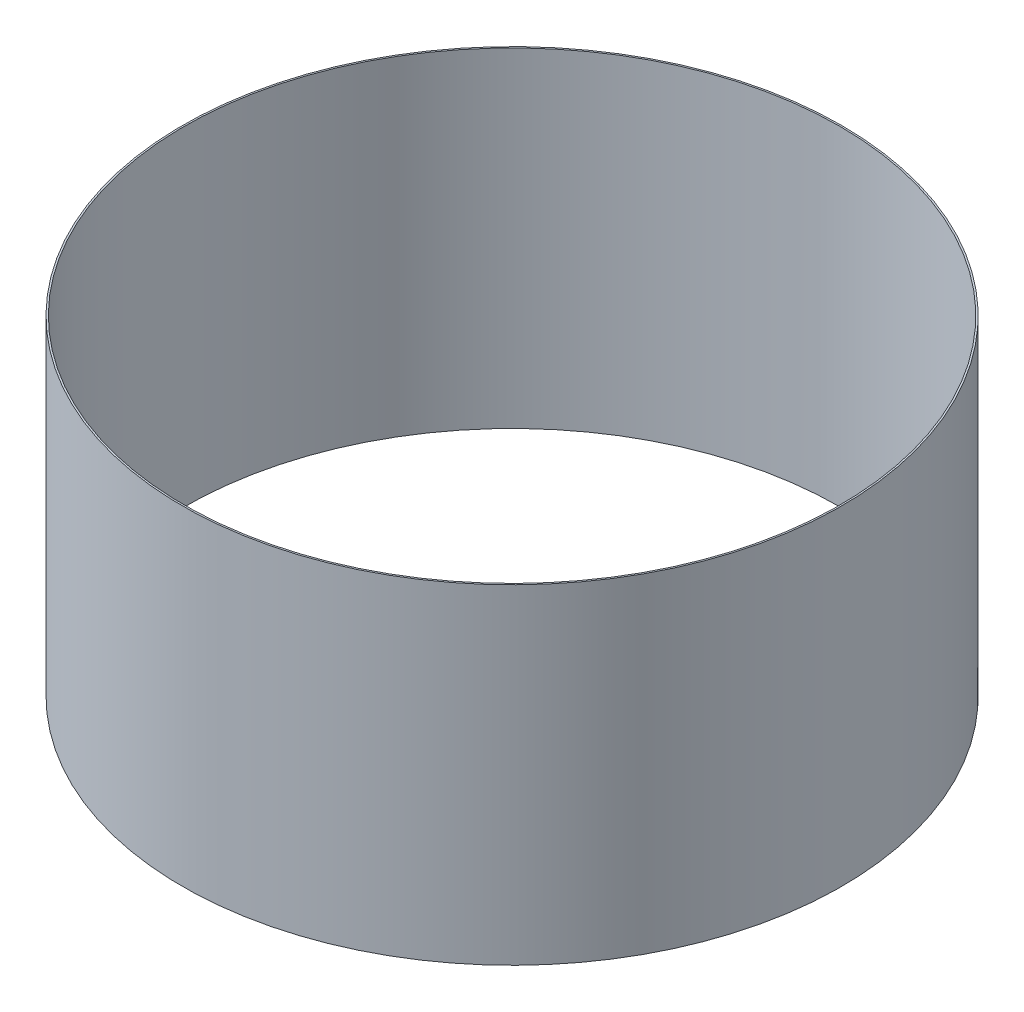
ISO-10303-21;
HEADER;
FILE_DESCRIPTION(('STEP AP214'),'2;1');
FILE_NAME('part.step','',(''),(''),'','','');
FILE_SCHEMA(('AUTOMOTIVE_DESIGN { 1 0 10303 214 1 1 1 1 }'));
ENDSEC;
DATA;
#1=APPLICATION_CONTEXT('core data for automotive mechanical design processes');
#2=APPLICATION_PROTOCOL_DEFINITION('international standard','automotive_design',2000,#1);
#3=PRODUCT_CONTEXT('',#1,'mechanical');
#4=PRODUCT('Part','Part','',(#3));
#5=PRODUCT_RELATED_PRODUCT_CATEGORY('part','',(#4));
#6=PRODUCT_DEFINITION_FORMATION('','',#4);
#7=PRODUCT_DEFINITION_CONTEXT('part definition',#1,'design');
#8=PRODUCT_DEFINITION('design','',#6,#7);
#9=PRODUCT_DEFINITION_SHAPE('','',#8);
#10=(LENGTH_UNIT() NAMED_UNIT(*) SI_UNIT(.MILLI.,.METRE.));
#11=(NAMED_UNIT(*) PLANE_ANGLE_UNIT() SI_UNIT($,.RADIAN.));
#12=(NAMED_UNIT(*) SI_UNIT($,.STERADIAN.) SOLID_ANGLE_UNIT());
#13=UNCERTAINTY_MEASURE_WITH_UNIT(LENGTH_MEASURE(1.E-05),#10,'distance_accuracy_value','');
#14=(GEOMETRIC_REPRESENTATION_CONTEXT(3) GLOBAL_UNCERTAINTY_ASSIGNED_CONTEXT((#13)) GLOBAL_UNIT_ASSIGNED_CONTEXT((#10,
#11,#12)) REPRESENTATION_CONTEXT('',''));
#15=CARTESIAN_POINT('',(0.,0.,0.));
#16=DIRECTION('',(0.,0.,1.));
#17=DIRECTION('',(1.,0.,0.));
#18=AXIS2_PLACEMENT_3D('',#15,#16,#17);
#19=CARTESIAN_POINT('',(0.,200.,0.));
#20=DIRECTION('',(0.,-1.,0.));
#21=DIRECTION('',(0.,0.,-1.));
#22=AXIS2_PLACEMENT_3D('',#19,#20,#21);
#23=CYLINDRICAL_SURFACE('',#22,200.);
#24=CARTESIAN_POINT('',(0.,0.,0.));
#25=DIRECTION('',(0.,1.,0.));
#26=DIRECTION('',(1.,0.,0.));
#27=AXIS2_PLACEMENT_3D('',#24,#25,#26);
#28=CIRCLE('',#27,200.);
#29=CARTESIAN_POINT('',(-0.0050251256281361,0.,-199.99999993687));
#30=VERTEX_POINT('',#29);
#31=CARTESIAN_POINT('',(0.0050251256281606,0.,-199.99999993687));
#32=VERTEX_POINT('',#31);
#33=EDGE_CURVE('E102',#30,#32,#28,.T.);
#34=ORIENTED_EDGE('',*,*,#33,.T.);
#35=DIRECTION('',(0.,-1.,0.));
#36=VECTOR('',#35,1.);
#37=CARTESIAN_POINT('',(0.0050251256281606,200.,-199.99999993687));
#38=LINE('',#37,#36);
#39=CARTESIAN_POINT('',(0.0050251256281606,200.,-199.99999993687));
#40=VERTEX_POINT('',#39);
#41=EDGE_CURVE('E12',#40,#32,#38,.T.);
#42=ORIENTED_EDGE('',*,*,#41,.F.);
#43=CARTESIAN_POINT('',(0.,200.,0.));
#44=DIRECTION('',(0.,1.,0.));
#45=DIRECTION('',(1.,0.,0.));
#46=AXIS2_PLACEMENT_3D('',#43,#44,#45);
#47=CIRCLE('',#46,200.);
#48=CARTESIAN_POINT('',(-0.0050251256281361,200.,-199.99999993687));
#49=VERTEX_POINT('',#48);
#50=EDGE_CURVE('E79',#49,#40,#47,.T.);
#51=ORIENTED_EDGE('',*,*,#50,.F.);
#52=DIRECTION('',(0.,-1.,0.));
#53=VECTOR('',#52,1.);
#54=CARTESIAN_POINT('',(-0.0050251256281361,200.,-199.99999993687));
#55=LINE('',#54,#53);
#56=EDGE_CURVE('E55',#49,#30,#55,.T.);
#57=ORIENTED_EDGE('',*,*,#56,.T.);
#58=EDGE_LOOP('',(#34,#42,#51,#57));
#59=FACE_BOUND('',#58,.T.);
#60=ADVANCED_FACE('F39',(#59),#23,.T.);
#61=CARTESIAN_POINT('',(0.00500000000003198,200.,-198.999999937186));
#62=DIRECTION('',(-0.999999999684351,0.,-2.51256281286176E-05));
#63=DIRECTION('',(-2.51256281286176E-05,0.,0.999999999684351));
#64=AXIS2_PLACEMENT_3D('',#61,#62,#63);
#65=PLANE('',#64);
#66=DIRECTION('',(2.51256281286176E-05,0.,-0.999999999684351));
#67=VECTOR('',#66,1.);
#68=CARTESIAN_POINT('',(0.00500000000003198,0.,-198.999999937186));
#69=LINE('',#68,#67);
#70=CARTESIAN_POINT('',(0.00500000000003198,0.,-198.999999937186));
#71=VERTEX_POINT('',#70);
#72=EDGE_CURVE('E88',#71,#32,#69,.T.);
#73=ORIENTED_EDGE('',*,*,#72,.F.);
#74=DIRECTION('',(0.,-1.,0.));
#75=VECTOR('',#74,1.);
#76=CARTESIAN_POINT('',(0.00500000000003198,200.,-198.999999937186));
#77=LINE('',#76,#75);
#78=CARTESIAN_POINT('',(0.00500000000003198,200.,-198.999999937186));
#79=VERTEX_POINT('',#78);
#80=EDGE_CURVE('E47',#79,#71,#77,.T.);
#81=ORIENTED_EDGE('',*,*,#80,.F.);
#82=DIRECTION('',(2.51256281286176E-05,0.,-0.999999999684351));
#83=VECTOR('',#82,1.);
#84=CARTESIAN_POINT('',(0.00500000000003198,200.,-198.999999937186));
#85=LINE('',#84,#83);
#86=EDGE_CURVE('E86',#79,#40,#85,.T.);
#87=ORIENTED_EDGE('',*,*,#86,.T.);
#88=ORIENTED_EDGE('',*,*,#41,.T.);
#89=EDGE_LOOP('',(#73,#81,#87,#88));
#90=FACE_BOUND('',#89,.T.);
#91=ADVANCED_FACE('F85',(#90),#65,.T.);
#92=CARTESIAN_POINT('',(0.,200.,0.));
#93=DIRECTION('',(0.,-1.,0.));
#94=DIRECTION('',(0.,0.,-1.));
#95=AXIS2_PLACEMENT_3D('',#92,#93,#94);
#96=CYLINDRICAL_SURFACE('',#95,199.);
#97=CARTESIAN_POINT('',(0.,0.,0.));
#98=DIRECTION('',(0.,1.,0.));
#99=DIRECTION('',(0.,0.,1.));
#100=AXIS2_PLACEMENT_3D('',#97,#98,#99);
#101=CIRCLE('',#100,199.);
#102=CARTESIAN_POINT('',(-0.00499999999998324,0.,-198.999999937186));
#103=VERTEX_POINT('',#102);
#104=EDGE_CURVE('E105',#103,#71,#101,.T.);
#105=ORIENTED_EDGE('',*,*,#104,.F.);
#106=DIRECTION('',(0.,-1.,0.));
#107=VECTOR('',#106,1.);
#108=CARTESIAN_POINT('',(-0.00499999999998324,200.,-198.999999937186));
#109=LINE('',#108,#107);
#110=CARTESIAN_POINT('',(-0.00499999999998324,200.,-198.999999937186));
#111=VERTEX_POINT('',#110);
#112=EDGE_CURVE('E68',#111,#103,#109,.T.);
#113=ORIENTED_EDGE('',*,*,#112,.F.);
#114=CARTESIAN_POINT('',(0.,200.,0.));
#115=DIRECTION('',(0.,1.,0.));
#116=DIRECTION('',(0.,0.,1.));
#117=AXIS2_PLACEMENT_3D('',#114,#115,#116);
#118=CIRCLE('',#117,199.);
#119=EDGE_CURVE('E94',#111,#79,#118,.T.);
#120=ORIENTED_EDGE('',*,*,#119,.T.);
#121=ORIENTED_EDGE('',*,*,#80,.T.);
#122=EDGE_LOOP('',(#105,#113,#120,#121));
#123=FACE_BOUND('',#122,.T.);
#124=ADVANCED_FACE('F96',(#123),#96,.F.);
#125=CARTESIAN_POINT('',(-0.0050251256281361,200.,-199.99999993687));
#126=DIRECTION('',(0.999999999684351,0.,-2.51256281528648E-05));
#127=DIRECTION('',(-2.51256281528648E-05,0.,-0.999999999684351));
#128=AXIS2_PLACEMENT_3D('',#125,#126,#127);
#129=PLANE('',#128);
#130=DIRECTION('',(2.51256281528647E-05,0.,0.999999999684351));
#131=VECTOR('',#130,1.);
#132=CARTESIAN_POINT('',(-0.0050251256281361,0.,-199.99999993687));
#133=LINE('',#132,#131);
#134=EDGE_CURVE('E107',#30,#103,#133,.T.);
#135=ORIENTED_EDGE('',*,*,#134,.F.);
#136=ORIENTED_EDGE('',*,*,#56,.F.);
#137=DIRECTION('',(2.51256281528647E-05,0.,0.999999999684351));
#138=VECTOR('',#137,1.);
#139=CARTESIAN_POINT('',(-0.0050251256281361,200.,-199.99999993687));
#140=LINE('',#139,#138);
#141=EDGE_CURVE('E97',#49,#111,#140,.T.);
#142=ORIENTED_EDGE('',*,*,#141,.T.);
#143=ORIENTED_EDGE('',*,*,#112,.T.);
#144=EDGE_LOOP('',(#135,#136,#142,#143));
#145=FACE_BOUND('',#144,.T.);
#146=ADVANCED_FACE('F113',(#145),#129,.T.);
#147=CARTESIAN_POINT('',(0.,200.,0.));
#148=DIRECTION('',(0.,1.,0.));
#149=DIRECTION('',(1.,0.,0.));
#150=AXIS2_PLACEMENT_3D('',#147,#148,#149);
#151=PLANE('',#150);
#152=ORIENTED_EDGE('',*,*,#50,.T.);
#153=ORIENTED_EDGE('',*,*,#86,.F.);
#154=ORIENTED_EDGE('',*,*,#119,.F.);
#155=ORIENTED_EDGE('',*,*,#141,.F.);
#156=EDGE_LOOP('',(#152,#153,#154,#155));
#157=FACE_BOUND('',#156,.T.);
#158=ADVANCED_FACE('F93',(#157),#151,.T.);
#159=CARTESIAN_POINT('',(0.,0.,0.));
#160=DIRECTION('',(0.,1.,0.));
#161=DIRECTION('',(1.,0.,0.));
#162=AXIS2_PLACEMENT_3D('',#159,#160,#161);
#163=PLANE('',#162);
#164=ORIENTED_EDGE('',*,*,#33,.F.);
#165=ORIENTED_EDGE('',*,*,#134,.T.);
#166=ORIENTED_EDGE('',*,*,#104,.T.);
#167=ORIENTED_EDGE('',*,*,#72,.T.);
#168=EDGE_LOOP('',(#164,#165,#166,#167));
#169=FACE_BOUND('',#168,.T.);
#170=ADVANCED_FACE('F112',(#169),#163,.F.);
#171=CLOSED_SHELL('',(#60,#91,#124,#146,#158,#170));
#172=MANIFOLD_SOLID_BREP('B2',#171);
#173=ADVANCED_BREP_SHAPE_REPRESENTATION('',(#18,#172),#14);
#174=SHAPE_DEFINITION_REPRESENTATION(#9,#173);
ENDSEC;
END-ISO-10303-21;
